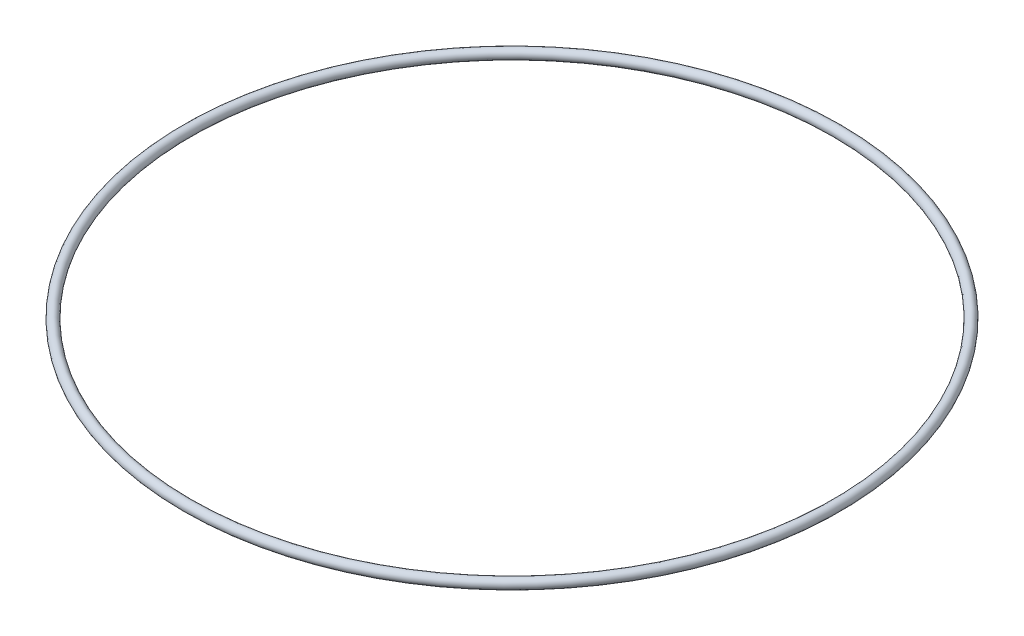
ISO-10303-21;
HEADER;
FILE_DESCRIPTION(('STEP AP214'),'2;1');
FILE_NAME('part.step','',(''),(''),'','','');
FILE_SCHEMA(('AUTOMOTIVE_DESIGN { 1 0 10303 214 1 1 1 1 }'));
ENDSEC;
DATA;
#1=APPLICATION_CONTEXT('core data for automotive mechanical design processes');
#2=APPLICATION_PROTOCOL_DEFINITION('international standard','automotive_design',2000,#1);
#3=PRODUCT_CONTEXT('',#1,'mechanical');
#4=PRODUCT('Part','Part','',(#3));
#5=PRODUCT_RELATED_PRODUCT_CATEGORY('part','',(#4));
#6=PRODUCT_DEFINITION_FORMATION('','',#4);
#7=PRODUCT_DEFINITION_CONTEXT('part definition',#1,'design');
#8=PRODUCT_DEFINITION('design','',#6,#7);
#9=PRODUCT_DEFINITION_SHAPE('','',#8);
#10=(LENGTH_UNIT() NAMED_UNIT(*) SI_UNIT(.MILLI.,.METRE.));
#11=(NAMED_UNIT(*) PLANE_ANGLE_UNIT() SI_UNIT($,.RADIAN.));
#12=(NAMED_UNIT(*) SI_UNIT($,.STERADIAN.) SOLID_ANGLE_UNIT());
#13=UNCERTAINTY_MEASURE_WITH_UNIT(LENGTH_MEASURE(1.E-05),#10,'distance_accuracy_value','');
#14=(GEOMETRIC_REPRESENTATION_CONTEXT(3) GLOBAL_UNCERTAINTY_ASSIGNED_CONTEXT((#13)) GLOBAL_UNIT_ASSIGNED_CONTEXT((#10,
#11,#12)) REPRESENTATION_CONTEXT('',''));
#15=CARTESIAN_POINT('',(0.,0.,0.));
#16=DIRECTION('',(0.,0.,1.));
#17=DIRECTION('',(1.,0.,0.));
#18=AXIS2_PLACEMENT_3D('',#15,#16,#17);
#19=CARTESIAN_POINT('',(0.,0.,0.));
#20=DIRECTION('',(0.,-1.,0.));
#21=DIRECTION('',(0.,0.,-1.));
#22=AXIS2_PLACEMENT_3D('',#19,#20,#21);
#23=TOROIDAL_SURFACE('',#22,197.,2.99999999999999);
#24=CARTESIAN_POINT('',(0.,0.,-200.));
#25=VERTEX_POINT('',#24);
#26=VERTEX_LOOP('',#25);
#27=FACE_BOUND('',#26,.T.);
#28=ADVANCED_FACE('F39',(#27),#23,.T.);
#29=CLOSED_SHELL('',(#28));
#30=MANIFOLD_SOLID_BREP('B2',#29);
#31=ADVANCED_BREP_SHAPE_REPRESENTATION('',(#18,#30),#14);
#32=SHAPE_DEFINITION_REPRESENTATION(#9,#31);
ENDSEC;
END-ISO-10303-21;
